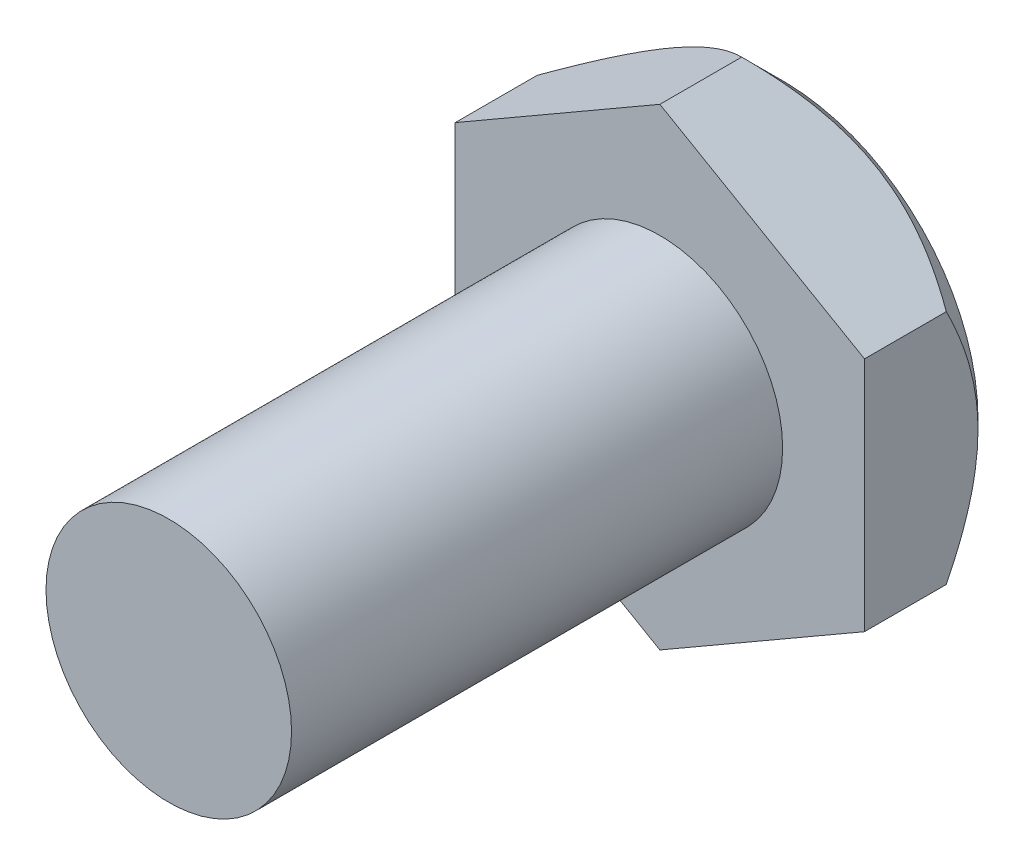
ISO-10303-21;
HEADER;
FILE_DESCRIPTION(('STEP AP214'),'2;1');
FILE_NAME('part.step','',(''),(''),'','','');
FILE_SCHEMA(('AUTOMOTIVE_DESIGN { 1 0 10303 214 1 1 1 1 }'));
ENDSEC;
DATA;
#1=APPLICATION_CONTEXT('core data for automotive mechanical design processes');
#2=APPLICATION_PROTOCOL_DEFINITION('international standard','automotive_design',2000,#1);
#3=PRODUCT_CONTEXT('',#1,'mechanical');
#4=PRODUCT('Part','Part','',(#3));
#5=PRODUCT_RELATED_PRODUCT_CATEGORY('part','',(#4));
#6=PRODUCT_DEFINITION_FORMATION('','',#4);
#7=PRODUCT_DEFINITION_CONTEXT('part definition',#1,'design');
#8=PRODUCT_DEFINITION('design','',#6,#7);
#9=PRODUCT_DEFINITION_SHAPE('','',#8);
#10=(LENGTH_UNIT() NAMED_UNIT(*) SI_UNIT(.MILLI.,.METRE.));
#11=(NAMED_UNIT(*) PLANE_ANGLE_UNIT() SI_UNIT($,.RADIAN.));
#12=(NAMED_UNIT(*) SI_UNIT($,.STERADIAN.) SOLID_ANGLE_UNIT());
#13=UNCERTAINTY_MEASURE_WITH_UNIT(LENGTH_MEASURE(1.E-05),#10,'distance_accuracy_value','');
#14=(GEOMETRIC_REPRESENTATION_CONTEXT(3) GLOBAL_UNCERTAINTY_ASSIGNED_CONTEXT((#13)) GLOBAL_UNIT_ASSIGNED_CONTEXT((#10,
#11,#12)) REPRESENTATION_CONTEXT('',''));
#15=CARTESIAN_POINT('',(0.,0.,0.));
#16=DIRECTION('',(0.,0.,1.));
#17=DIRECTION('',(1.,0.,0.));
#18=AXIS2_PLACEMENT_3D('',#15,#16,#17);
#19=CARTESIAN_POINT('',(-5.,-2.88675134594813,3.));
#20=DIRECTION('',(0.5,0.866025403784439,0.));
#21=DIRECTION('',(-0.866025403784439,0.5,0.));
#22=AXIS2_PLACEMENT_3D('',#19,#20,#21);
#23=PLANE('',#22);
#24=CARTESIAN_POINT('',(0.000199999999999995,-5.77361816195009,1.00011547351787));
#25=CARTESIAN_POINT('',(-0.0857727681733071,-5.72398176110226,0.950483545604258));
#26=CARTESIAN_POINT('',(-0.172406369471809,-5.6739638280717,0.902374725286902));
#27=CARTESIAN_POINT('',(-0.347124889028838,-5.57309004377304,0.809666631329777));
#28=CARTESIAN_POINT('',(-0.435210568643609,-5.5222337529357,0.765069274501485));
#29=CARTESIAN_POINT('',(-0.702658569860328,-5.367822577439,0.636859072128254));
#30=CARTESIAN_POINT('',(-0.884284999421825,-5.26296050943972,0.559375065501519));
#31=CARTESIAN_POINT('',(-1.25054924277182,-5.05149774994707,0.426688944425516));
#32=CARTESIAN_POINT('',(-1.4350934376246,-4.94495110937143,0.371152540645836));
#33=CARTESIAN_POINT('',(-1.71494377217237,-4.78337944338747,0.306910494047517));
#34=CARTESIAN_POINT('',(-1.80863923991279,-4.72928433986569,0.288682163338637));
#35=CARTESIAN_POINT('',(-1.99682352572352,-4.6206360917956,0.258992187126121));
#36=CARTESIAN_POINT('',(-2.09131222308104,-4.56608301694086,0.247529530305084));
#37=CARTESIAN_POINT('',(-2.32156625980077,-4.43314578685873,0.228310861745981));
#38=CARTESIAN_POINT('',(-2.45757968486242,-4.35461839928599,0.224278288259711));
#39=CARTESIAN_POINT('',(-2.72936141189438,-4.19770514602326,0.231045854105308));
#40=CARTESIAN_POINT('',(-2.86512961123581,-4.1193193395861,0.241851192970995));
#41=CARTESIAN_POINT('',(-3.13538603207474,-3.96328672226451,0.277657649898035));
#42=CARTESIAN_POINT('',(-3.26987265077583,-3.88564083675504,0.302674643958259));
#43=CARTESIAN_POINT('',(-3.53653439939645,-3.73168360440635,0.36554432498943));
#44=CARTESIAN_POINT('',(-3.66870970573535,-3.65537215571136,0.403396027767556));
#45=CARTESIAN_POINT('',(-3.9033482065223,-3.51990355411977,0.481269886760533));
#46=CARTESIAN_POINT('',(-4.00633089069878,-3.4604464736886,0.519244250419013));
#47=CARTESIAN_POINT('',(-4.21044753419216,-3.34259967462162,0.601312626173942));
#48=CARTESIAN_POINT('',(-4.31158143726391,-3.28420998845895,0.645406824103549));
#49=CARTESIAN_POINT('',(-4.51168198823797,-3.16868188148908,0.738726385352358));
#50=CARTESIAN_POINT('',(-4.61065432718708,-3.11154017495448,0.787935612709389));
#51=CARTESIAN_POINT('',(-4.80676624461304,-2.99831490663731,0.890839122843004));
#52=CARTESIAN_POINT('',(-4.90390690306938,-2.94223072132829,0.944530654549019));
#53=CARTESIAN_POINT('',(-5.0002,-2.88663587589429,1.00011547351787));
#54=B_SPLINE_CURVE_WITH_KNOTS('',3,(#24,#25,#26,#27,#28,#29,#30,#31,#32,#33,#34,#35,#36,#37,#38,
#39,#40,#41,#42,#43,#44,#45,#46,#47,#48,#49,#50,#51,#52,#53),.UNSPECIFIED.,.F.,.F.,(4,2,2,2,2,2,
2,2,2,2,2,2,2,2,4),(0.,0.332945616209567,0.666071736106988,1.33592065243334,1.99513262597481,
2.32409207808823,2.6530023456369,3.12358963991982,3.59434188052352,4.06562104077025,
4.53686407049608,4.91117956742315,5.28550643319669,5.65868635377114,6.03163889109472),.UNSPECIFIED.);
#55=CARTESIAN_POINT('',(0.,-5.77350269189626,1.));
#56=VERTEX_POINT('',#55);
#57=CARTESIAN_POINT('',(-5.,-2.88675134594813,1.));
#58=VERTEX_POINT('',#57);
#59=EDGE_CURVE('E68',#56,#58,#54,.T.);
#60=ORIENTED_EDGE('',*,*,#59,.F.);
#61=DIRECTION('',(0.,0.,-1.));
#62=VECTOR('',#61,1.);
#63=CARTESIAN_POINT('',(0.,-5.77350269189626,3.));
#64=LINE('',#63,#62);
#65=CARTESIAN_POINT('',(0.,-5.77350269189626,3.));
#66=VERTEX_POINT('',#65);
#67=EDGE_CURVE('E54',#66,#56,#64,.T.);
#68=ORIENTED_EDGE('',*,*,#67,.F.);
#69=DIRECTION('',(0.866025403784439,-0.5,0.));
#70=VECTOR('',#69,1.);
#71=CARTESIAN_POINT('',(-5.,-2.88675134594813,3.));
#72=LINE('',#71,#70);
#73=CARTESIAN_POINT('',(-5.,-2.88675134594813,3.));
#74=VERTEX_POINT('',#73);
#75=EDGE_CURVE('E159',#74,#66,#72,.T.);
#76=ORIENTED_EDGE('',*,*,#75,.F.);
#77=DIRECTION('',(0.,0.,-1.));
#78=VECTOR('',#77,1.);
#79=CARTESIAN_POINT('',(-5.,-2.88675134594813,3.));
#80=LINE('',#79,#78);
#81=EDGE_CURVE('E141',#74,#58,#80,.T.);
#82=ORIENTED_EDGE('',*,*,#81,.T.);
#83=EDGE_LOOP('',(#60,#68,#76,#82));
#84=FACE_BOUND('',#83,.T.);
#85=ADVANCED_FACE('F51',(#84),#23,.F.);
#86=CARTESIAN_POINT('',(0.,-5.77350269189626,3.));
#87=DIRECTION('',(-0.5,0.866025403784438,0.));
#88=DIRECTION('',(-0.866025403784438,-0.5,0.));
#89=AXIS2_PLACEMENT_3D('',#86,#87,#88);
#90=PLANE('',#89);
#91=CARTESIAN_POINT('',(5.0002,-2.88663587589429,1.00011547351787));
#92=CARTESIAN_POINT('',(4.91422723182669,-2.93627227674212,0.950483545604257));
#93=CARTESIAN_POINT('',(4.82759363052819,-2.98629020977268,0.902374725286901));
#94=CARTESIAN_POINT('',(4.65287511097116,-3.08716399407134,0.809666631329776));
#95=CARTESIAN_POINT('',(4.56478943135639,-3.13802028490868,0.765069274501483));
#96=CARTESIAN_POINT('',(4.29734143013967,-3.29243146040538,0.636859072128253));
#97=CARTESIAN_POINT('',(4.11571500057817,-3.39729352840466,0.559375065501518));
#98=CARTESIAN_POINT('',(3.74945075722818,-3.60875628789732,0.426688944425514));
#99=CARTESIAN_POINT('',(3.5649065623754,-3.71530292847296,0.371152540645833));
#100=CARTESIAN_POINT('',(3.28505622782763,-3.87687459445692,0.306910494047514));
#101=CARTESIAN_POINT('',(3.19136076008721,-3.9309696979787,0.288682163338634));
#102=CARTESIAN_POINT('',(3.00317647427648,-4.03961794604878,0.258992187126118));
#103=CARTESIAN_POINT('',(2.90868777691895,-4.09417102090352,0.247529530305082));
#104=CARTESIAN_POINT('',(2.67843374019923,-4.22710825098565,0.228310861745979));
#105=CARTESIAN_POINT('',(2.54242031513758,-4.3056356385584,0.224278288259709));
#106=CARTESIAN_POINT('',(2.27063858810562,-4.46254889182113,0.231045854105305));
#107=CARTESIAN_POINT('',(2.13487038876419,-4.54093469825829,0.241851192970993));
#108=CARTESIAN_POINT('',(1.86461396792526,-4.69696731557987,0.277657649898033));
#109=CARTESIAN_POINT('',(1.73012734922417,-4.77461320108935,0.302674643958258));
#110=CARTESIAN_POINT('',(1.46346560060355,-4.92857043343804,0.365544324989429));
#111=CARTESIAN_POINT('',(1.33129029426465,-5.00488188213303,0.403396027767555));
#112=CARTESIAN_POINT('',(1.0966517934777,-5.14035048372462,0.481269886760531));
#113=CARTESIAN_POINT('',(0.993669109301218,-5.19980756415578,0.519244250419011));
#114=CARTESIAN_POINT('',(0.78955246580784,-5.31765436322277,0.601312626173941));
#115=CARTESIAN_POINT('',(0.688418562736091,-5.37604404938544,0.645406824103548));
#116=CARTESIAN_POINT('',(0.488318011762032,-5.4915721563553,0.738726385352357));
#117=CARTESIAN_POINT('',(0.389345672812915,-5.5487138628899,0.787935612709388));
#118=CARTESIAN_POINT('',(0.19323375538696,-5.66193913120707,0.890839122843003));
#119=CARTESIAN_POINT('',(0.0960930969306197,-5.7180233165161,0.944530654549018));
#120=CARTESIAN_POINT('',(-0.00020000000000003,-5.7736181619501,1.00011547351787));
#121=B_SPLINE_CURVE_WITH_KNOTS('',3,(#91,#92,#93,#94,#95,#96,#97,#98,#99,#100,#101,#102,#103,
#104,#105,#106,#107,#108,#109,#110,#111,#112,#113,#114,#115,#116,#117,#118,#119,#120),
.UNSPECIFIED.,.F.,.F.,(4,2,2,2,2,2,2,2,2,2,2,2,2,2,4),(0.,0.332945616209567,0.666071736106989,
1.33592065243334,1.99513262597481,2.32409207808823,2.6530023456369,3.12358963991982,
3.59434188052352,4.06562104077025,4.53686407049609,4.91117956742315,5.28550643319669,
5.65868635377115,6.03163889109473),.UNSPECIFIED.);
#122=CARTESIAN_POINT('',(5.,-2.88675134594813,1.));
#123=VERTEX_POINT('',#122);
#124=EDGE_CURVE('E126',#123,#56,#121,.T.);
#125=ORIENTED_EDGE('',*,*,#124,.F.);
#126=DIRECTION('',(0.,0.,-1.));
#127=VECTOR('',#126,1.);
#128=CARTESIAN_POINT('',(5.,-2.88675134594813,3.));
#129=LINE('',#128,#127);
#130=CARTESIAN_POINT('',(5.,-2.88675134594813,3.));
#131=VERTEX_POINT('',#130);
#132=EDGE_CURVE('E127',#131,#123,#129,.T.);
#133=ORIENTED_EDGE('',*,*,#132,.F.);
#134=DIRECTION('',(0.866025403784438,0.5,0.));
#135=VECTOR('',#134,1.);
#136=CARTESIAN_POINT('',(0.,-5.77350269189626,3.));
#137=LINE('',#136,#135);
#138=EDGE_CURVE('E160',#66,#131,#137,.T.);
#139=ORIENTED_EDGE('',*,*,#138,.F.);
#140=ORIENTED_EDGE('',*,*,#67,.T.);
#141=EDGE_LOOP('',(#125,#133,#139,#140));
#142=FACE_BOUND('',#141,.T.);
#143=ADVANCED_FACE('F216',(#142),#90,.F.);
#144=CARTESIAN_POINT('',(5.,-2.88675134594813,3.));
#145=DIRECTION('',(-1.,0.,0.));
#146=DIRECTION('',(0.,-1.,0.));
#147=AXIS2_PLACEMENT_3D('',#144,#145,#146);
#148=PLANE('',#147);
#149=CARTESIAN_POINT('',(5.,8.74641662303045,5.30120840786354));
#150=CARTESIAN_POINT('',(5.,8.61716722747173,5.18900265269324));
#151=CARTESIAN_POINT('',(5.,8.4876177762151,5.07714279282813));
#152=CARTESIAN_POINT('',(5.,8.22783886568773,4.85421137306163));
#153=CARTESIAN_POINT('',(5.,8.09760939532867,4.74313982608448));
#154=CARTESIAN_POINT('',(5.,7.70566734866917,4.41115617610398));
#155=CARTESIAN_POINT('',(5.,7.44281985997348,4.19157843738422));
#156=CARTESIAN_POINT('',(5.,6.90728256215141,3.75214021004564));
#157=CARTESIAN_POINT('',(5.,6.63450482165786,3.53238666470403));
#158=CARTESIAN_POINT('',(5.,6.0838296799802,3.09948407125663));
#159=CARTESIAN_POINT('',(5.,5.80593357662146,2.8863333846965));
#160=CARTESIAN_POINT('',(5.,5.38378753376033,2.57335417688988));
#161=CARTESIAN_POINT('',(5.,5.24208933175034,2.47008359846257));
#162=CARTESIAN_POINT('',(5.,4.95671624927881,2.26631520865756));
#163=CARTESIAN_POINT('',(5.,4.81304144911579,2.1658172851374));
#164=CARTESIAN_POINT('',(5.,4.52327399537162,1.96806860455872));
#165=CARTESIAN_POINT('',(5.,4.37717923691745,1.87082092322896));
#166=CARTESIAN_POINT('',(5.,4.08235982087795,1.68041025635652));
#167=CARTESIAN_POINT('',(5.,3.93363539364334,1.58724691550166));
#168=CARTESIAN_POINT('',(5.,3.63427030631389,1.40660875248025));
#169=CARTESIAN_POINT('',(5.,3.48365224734247,1.31909664823556));
#170=CARTESIAN_POINT('',(5.,3.17899028727337,1.15017049908506));
#171=CARTESIAN_POINT('',(5.,3.02494597608893,1.06875718929086));
#172=CARTESIAN_POINT('',(5.,2.71327651039533,0.913643190475442));
#173=CARTESIAN_POINT('',(5.,2.5556569897211,0.839931271085124));
#174=CARTESIAN_POINT('',(5.,2.23636855072573,0.701954577855023));
#175=CARTESIAN_POINT('',(5.,2.07470123003844,0.637686143454943));
#176=CARTESIAN_POINT('',(5.,1.74341514966677,0.519419891787053));
#177=CARTESIAN_POINT('',(5.,1.57369908899831,0.465690806004504));
#178=CARTESIAN_POINT('',(5.,1.23024809831044,0.372972773426494));
#179=CARTESIAN_POINT('',(5.,1.05651381384527,0.333981476125331));
#180=CARTESIAN_POINT('',(5.,0.707111716198539,0.273340953601916));
#181=CARTESIAN_POINT('',(5.,0.53146295994004,0.251584101926988));
#182=CARTESIAN_POINT('',(5.,0.17884205730549,0.226605435627371));
#183=CARTESIAN_POINT('',(5.,0.00187005969027966,0.223381567957098));
#184=CARTESIAN_POINT('',(5.,-0.351677312644601,0.235729427957355));
#185=CARTESIAN_POINT('',(5.,-0.528251644969084,0.251330345354395));
#186=CARTESIAN_POINT('',(5.,-0.878922878802893,0.300185950940643));
#187=CARTESIAN_POINT('',(5.,-1.05301927886701,0.333444161614084));
#188=CARTESIAN_POINT('',(5.,-1.3987045104717,0.415712242024392));
#189=CARTESIAN_POINT('',(5.,-1.57026635442497,0.46483351901479));
#190=CARTESIAN_POINT('',(5.,-1.90902834045999,0.576149176266458));
#191=CARTESIAN_POINT('',(5.,-2.07622841650056,0.638343754340509));
#192=CARTESIAN_POINT('',(5.,-2.44237261212088,0.788103153381491));
#193=CARTESIAN_POINT('',(5.,-2.64025507818795,0.878241389720284));
#194=CARTESIAN_POINT('',(5.,-3.03013540194507,1.07054933532841));
#195=CARTESIAN_POINT('',(5.,-3.22212979396385,1.17272596527714));
#196=CARTESIAN_POINT('',(5.,-3.60131488951685,1.38644051823743));
#197=CARTESIAN_POINT('',(5.,-3.78849486749627,1.49799731621704));
#198=CARTESIAN_POINT('',(5.,-4.15840113964403,1.72813928385275));
#199=CARTESIAN_POINT('',(5.,-4.34112830476976,1.84672306322425));
#200=CARTESIAN_POINT('',(5.,-4.70385374189547,2.09002844075615));
#201=CARTESIAN_POINT('',(5.,-4.88383213902442,2.21477952902229));
#202=CARTESIAN_POINT('',(5.,-5.24067161838535,2.46866048898804));
#203=CARTESIAN_POINT('',(5.,-5.41753258815998,2.59779051816323));
#204=CARTESIAN_POINT('',(5.,-5.76843263526247,2.8593974426427));
#205=CARTESIAN_POINT('',(5.,-5.94247477144851,2.99187024633398));
#206=CARTESIAN_POINT('',(5.,-6.28836717451622,3.25965261483977));
#207=CARTESIAN_POINT('',(5.,-6.46021736942767,3.39496227241591));
#208=CARTESIAN_POINT('',(5.,-6.81175541238474,3.67565032556434));
#209=CARTESIAN_POINT('',(5.,-6.99133474536086,3.82116441788712));
#210=CARTESIAN_POINT('',(5.,-7.34874142921753,4.11432958177959));
#211=CARTESIAN_POINT('',(5.,-7.52656875943068,4.26198067850774));
#212=CARTESIAN_POINT('',(5.,-7.87878816127479,4.55742406898611));
#213=CARTESIAN_POINT('',(5.,-8.0531965095584,4.70519698599771));
#214=CARTESIAN_POINT('',(5.,-8.40071799614817,5.00218161213356));
#215=CARTESIAN_POINT('',(5.,-8.57383141139473,5.15139299703375));
#216=CARTESIAN_POINT('',(5.,-8.74641662303044,5.30120840786354));
#217=B_SPLINE_CURVE_WITH_KNOTS('',3,(#149,#150,#151,#152,#153,#154,#155,#156,#157,#158,#159,
#160,#161,#162,#163,#164,#165,#166,#167,#168,#169,#170,#171,#172,#173,#174,#175,#176,#177,#178,
#179,#180,#181,#182,#183,#184,#185,#186,#187,#188,#189,#190,#191,#192,#193,#194,#195,#196,#197,
#198,#199,#200,#201,#202,#203,#204,#205,#206,#207,#208,#209,#210,#211,#212,#213,#214,#215,#216),
.UNSPECIFIED.,.F.,.F.,(4,2,2,2,2,2,2,2,2,2,2,2,2,2,2,2,2,2,2,2,2,2,2,2,2,2,2,2,2,2,2,2,2,4),(0.,
0.513476804360356,1.02696200771218,2.05440464274526,3.10519307167231,4.15571863124172,
4.68170485901195,5.20766978152949,5.73411909352894,6.26052251646932,6.78299524430335,
7.30553084683201,7.82729351501778,8.34885339673756,8.88235034246742,9.4157621657062,
9.94581605965252,10.4758112341947,11.0066292768164,11.537553253067,12.0722901283652,
12.6070350953767,13.2588184936859,13.9109784370993,14.5644836027155,15.2178599015941,
15.874738064042,16.5316398742655,17.1877732869576,17.8439281879695,18.5373113067269,
19.2307025951712,19.9164752192631,20.6020967282288),.UNSPECIFIED.);
#218=CARTESIAN_POINT('',(5.,2.88675134594813,1.));
#219=VERTEX_POINT('',#218);
#220=EDGE_CURVE('E107',#219,#123,#217,.T.);
#221=ORIENTED_EDGE('',*,*,#220,.F.);
#222=DIRECTION('',(0.,0.,-1.));
#223=VECTOR('',#222,1.);
#224=CARTESIAN_POINT('',(5.,2.88675134594813,3.));
#225=LINE('',#224,#223);
#226=CARTESIAN_POINT('',(5.,2.88675134594813,3.));
#227=VERTEX_POINT('',#226);
#228=EDGE_CURVE('E123',#227,#219,#225,.T.);
#229=ORIENTED_EDGE('',*,*,#228,.F.);
#230=DIRECTION('',(0.,1.,0.));
#231=VECTOR('',#230,1.);
#232=CARTESIAN_POINT('',(5.,-2.88675134594813,3.));
#233=LINE('',#232,#231);
#234=EDGE_CURVE('E152',#131,#227,#233,.T.);
#235=ORIENTED_EDGE('',*,*,#234,.F.);
#236=ORIENTED_EDGE('',*,*,#132,.T.);
#237=EDGE_LOOP('',(#221,#229,#235,#236));
#238=FACE_BOUND('',#237,.T.);
#239=ADVANCED_FACE('F122',(#238),#148,.F.);
#240=CARTESIAN_POINT('',(5.,2.88675134594813,3.));
#241=DIRECTION('',(-0.5,-0.866025403784439,0.));
#242=DIRECTION('',(0.866025403784439,-0.5,0.));
#243=AXIS2_PLACEMENT_3D('',#240,#241,#242);
#244=PLANE('',#243);
#245=CARTESIAN_POINT('',(-0.000200000000002289,5.7736181619501,1.00011547351787));
#246=CARTESIAN_POINT('',(0.0857727681733046,5.72398176110226,0.950483545604261));
#247=CARTESIAN_POINT('',(0.172406369471806,5.67396382807171,0.902374725286905));
#248=CARTESIAN_POINT('',(0.347124889028836,5.57309004377304,0.80966663132978));
#249=CARTESIAN_POINT('',(0.435210568643606,5.5222337529357,0.765069274501488));
#250=CARTESIAN_POINT('',(0.702658569860326,5.367822577439,0.636859072128257));
#251=CARTESIAN_POINT('',(0.884284999421824,5.26296050943972,0.559375065501521));
#252=CARTESIAN_POINT('',(1.25054924277182,5.05149774994707,0.426688944425517));
#253=CARTESIAN_POINT('',(1.4350934376246,4.94495110937143,0.371152540645838));
#254=CARTESIAN_POINT('',(1.71494377217237,4.78337944338747,0.306910494047518));
#255=CARTESIAN_POINT('',(1.80863923991279,4.72928433986569,0.288682163338638));
#256=CARTESIAN_POINT('',(1.99682352572353,4.6206360917956,0.258992187126122));
#257=CARTESIAN_POINT('',(2.09131222308105,4.56608301694086,0.247529530305086));
#258=CARTESIAN_POINT('',(2.32156625980077,4.43314578685873,0.228310861745983));
#259=CARTESIAN_POINT('',(2.45757968486242,4.35461839928599,0.224278288259713));
#260=CARTESIAN_POINT('',(2.72936141189439,4.19770514602326,0.231045854105309));
#261=CARTESIAN_POINT('',(2.86512961123581,4.1193193395861,0.241851192970996));
#262=CARTESIAN_POINT('',(3.13538603207474,3.96328672226451,0.277657649898037));
#263=CARTESIAN_POINT('',(3.26987265077583,3.88564083675504,0.302674643958261));
#264=CARTESIAN_POINT('',(3.53653439939645,3.73168360440635,0.365544324989433));
#265=CARTESIAN_POINT('',(3.66870970573536,3.65537215571136,0.403396027767558));
#266=CARTESIAN_POINT('',(3.9033482065223,3.51990355411977,0.481269886760536));
#267=CARTESIAN_POINT('',(4.00633089069878,3.4604464736886,0.519244250419016));
#268=CARTESIAN_POINT('',(4.21044753419216,3.34259967462162,0.601312626173944));
#269=CARTESIAN_POINT('',(4.31158143726391,3.28420998845895,0.645406824103551));
#270=CARTESIAN_POINT('',(4.51168198823797,3.16868188148908,0.738726385352359));
#271=CARTESIAN_POINT('',(4.61065432718708,3.11154017495448,0.78793561270939));
#272=CARTESIAN_POINT('',(4.80676624461304,2.99831490663732,0.890839122843005));
#273=CARTESIAN_POINT('',(4.90390690306938,2.94223072132829,0.944530654549019));
#274=CARTESIAN_POINT('',(5.0002,2.88663587589429,1.00011547351787));
#275=B_SPLINE_CURVE_WITH_KNOTS('',3,(#245,#246,#247,#248,#249,#250,#251,#252,#253,#254,#255,
#256,#257,#258,#259,#260,#261,#262,#263,#264,#265,#266,#267,#268,#269,#270,#271,#272,#273,#274),
.UNSPECIFIED.,.F.,.F.,(4,2,2,2,2,2,2,2,2,2,2,2,2,2,4),(0.,0.332945616209567,0.666071736106989,
1.33592065243334,1.99513262597481,2.32409207808824,2.6530023456369,3.12358963991982,
3.59434188052352,4.06562104077026,4.53686407049609,4.91117956742316,5.28550643319669,
5.65868635377115,6.03163889109472),.UNSPECIFIED.);
#276=CARTESIAN_POINT('',(0.,5.77350269189626,1.));
#277=VERTEX_POINT('',#276);
#278=EDGE_CURVE('E104',#277,#219,#275,.T.);
#279=ORIENTED_EDGE('',*,*,#278,.F.);
#280=DIRECTION('',(0.,0.,-1.));
#281=VECTOR('',#280,1.);
#282=CARTESIAN_POINT('',(0.,5.77350269189626,3.));
#283=LINE('',#282,#281);
#284=CARTESIAN_POINT('',(0.,5.77350269189626,3.));
#285=VERTEX_POINT('',#284);
#286=EDGE_CURVE('E135',#285,#277,#283,.T.);
#287=ORIENTED_EDGE('',*,*,#286,.F.);
#288=DIRECTION('',(-0.866025403784439,0.5,0.));
#289=VECTOR('',#288,1.);
#290=CARTESIAN_POINT('',(5.,2.88675134594813,3.));
#291=LINE('',#290,#289);
#292=EDGE_CURVE('E134',#227,#285,#291,.T.);
#293=ORIENTED_EDGE('',*,*,#292,.F.);
#294=ORIENTED_EDGE('',*,*,#228,.T.);
#295=EDGE_LOOP('',(#279,#287,#293,#294));
#296=FACE_BOUND('',#295,.T.);
#297=ADVANCED_FACE('F128',(#296),#244,.F.);
#298=CARTESIAN_POINT('',(0.,5.77350269189626,3.));
#299=DIRECTION('',(0.5,-0.866025403784438,0.));
#300=DIRECTION('',(0.866025403784438,0.500000000000001,0.));
#301=AXIS2_PLACEMENT_3D('',#298,#299,#300);
#302=PLANE('',#301);
#303=CARTESIAN_POINT('',(-5.0002,2.88663587589429,1.00011547351787));
#304=CARTESIAN_POINT('',(-4.9142272318267,2.93627227674213,0.95048354560426));
#305=CARTESIAN_POINT('',(-4.82759363052819,2.98629020977268,0.902374725286904));
#306=CARTESIAN_POINT('',(-4.65287511097116,3.08716399407135,0.809666631329779));
#307=CARTESIAN_POINT('',(-4.56478943135639,3.13802028490869,0.765069274501486));
#308=CARTESIAN_POINT('',(-4.29734143013967,3.29243146040539,0.636859072128256));
#309=CARTESIAN_POINT('',(-4.11571500057818,3.39729352840467,0.559375065501521));
#310=CARTESIAN_POINT('',(-3.74945075722818,3.60875628789732,0.426688944425517));
#311=CARTESIAN_POINT('',(-3.5649065623754,3.71530292847296,0.371152540645837));
#312=CARTESIAN_POINT('',(-3.28505622782763,3.87687459445692,0.306910494047518));
#313=CARTESIAN_POINT('',(-3.19136076008721,3.9309696979787,0.288682163338639));
#314=CARTESIAN_POINT('',(-3.00317647427648,4.03961794604878,0.258992187126123));
#315=CARTESIAN_POINT('',(-2.90868777691896,4.09417102090353,0.247529530305086));
#316=CARTESIAN_POINT('',(-2.67843374019923,4.22710825098566,0.228310861745982));
#317=CARTESIAN_POINT('',(-2.54242031513758,4.3056356385584,0.224278288259713));
#318=CARTESIAN_POINT('',(-2.27063858810562,4.46254889182113,0.231045854105309));
#319=CARTESIAN_POINT('',(-2.13487038876419,4.54093469825829,0.241851192970996));
#320=CARTESIAN_POINT('',(-1.86461396792526,4.69696731557988,0.277657649898037));
#321=CARTESIAN_POINT('',(-1.73012734922417,4.77461320108935,0.302674643958262));
#322=CARTESIAN_POINT('',(-1.46346560060355,4.92857043343804,0.365544324989433));
#323=CARTESIAN_POINT('',(-1.33129029426465,5.00488188213303,0.403396027767559));
#324=CARTESIAN_POINT('',(-1.09665179347771,5.14035048372462,0.481269886760536));
#325=CARTESIAN_POINT('',(-0.99366910930122,5.19980756415579,0.519244250419016));
#326=CARTESIAN_POINT('',(-0.789552465807842,5.31765436322277,0.601312626173945));
#327=CARTESIAN_POINT('',(-0.688418562736092,5.37604404938544,0.645406824103552));
#328=CARTESIAN_POINT('',(-0.488318011762034,5.49157215635531,0.73872638535236));
#329=CARTESIAN_POINT('',(-0.389345672812917,5.54871386288991,0.787935612709392));
#330=CARTESIAN_POINT('',(-0.193233755386962,5.66193913120708,0.890839122843007));
#331=CARTESIAN_POINT('',(-0.0960930969306217,5.7180233165161,0.944530654549022));
#332=CARTESIAN_POINT('',(0.000199999999997294,5.7736181619501,1.00011547351787));
#333=B_SPLINE_CURVE_WITH_KNOTS('',3,(#303,#304,#305,#306,#307,#308,#309,#310,#311,#312,#313,
#314,#315,#316,#317,#318,#319,#320,#321,#322,#323,#324,#325,#326,#327,#328,#329,#330,#331,#332),
.UNSPECIFIED.,.F.,.F.,(4,2,2,2,2,2,2,2,2,2,2,2,2,2,4),(0.,0.332945616209567,0.666071736106989,
1.33592065243334,1.99513262597481,2.32409207808823,2.6530023456369,3.12358963991982,
3.59434188052352,4.06562104077025,4.53686407049609,4.91117956742315,5.28550643319669,
5.65868635377115,6.03163889109472),.UNSPECIFIED.);
#334=CARTESIAN_POINT('',(-5.,2.88675134594813,1.));
#335=VERTEX_POINT('',#334);
#336=EDGE_CURVE('E112',#335,#277,#333,.T.);
#337=ORIENTED_EDGE('',*,*,#336,.F.);
#338=DIRECTION('',(0.,0.,-1.));
#339=VECTOR('',#338,1.);
#340=CARTESIAN_POINT('',(-5.,2.88675134594813,3.));
#341=LINE('',#340,#339);
#342=CARTESIAN_POINT('',(-5.,2.88675134594813,3.));
#343=VERTEX_POINT('',#342);
#344=EDGE_CURVE('E140',#343,#335,#341,.T.);
#345=ORIENTED_EDGE('',*,*,#344,.F.);
#346=DIRECTION('',(-0.866025403784438,-0.500000000000001,0.));
#347=VECTOR('',#346,1.);
#348=CARTESIAN_POINT('',(0.,5.77350269189626,3.));
#349=LINE('',#348,#347);
#350=EDGE_CURVE('E149',#285,#343,#349,.T.);
#351=ORIENTED_EDGE('',*,*,#350,.F.);
#352=ORIENTED_EDGE('',*,*,#286,.T.);
#353=EDGE_LOOP('',(#337,#345,#351,#352));
#354=FACE_BOUND('',#353,.T.);
#355=ADVANCED_FACE('F243',(#354),#302,.F.);
#356=CARTESIAN_POINT('',(-5.,2.88675134594813,3.));
#357=DIRECTION('',(1.,0.,0.));
#358=DIRECTION('',(0.,1.,0.));
#359=AXIS2_PLACEMENT_3D('',#356,#357,#358);
#360=PLANE('',#359);
#361=CARTESIAN_POINT('',(-5.,-8.74641662303044,5.30120840786354));
#362=CARTESIAN_POINT('',(-5.,-8.61716722747173,5.18900265269323));
#363=CARTESIAN_POINT('',(-5.,-8.4876177762151,5.07714279282812));
#364=CARTESIAN_POINT('',(-5.,-8.22783886568772,4.85421137306163));
#365=CARTESIAN_POINT('',(-5.,-8.09760939532867,4.74313982608447));
#366=CARTESIAN_POINT('',(-5.,-7.70566734866916,4.41115617610397));
#367=CARTESIAN_POINT('',(-5.,-7.44281985997348,4.19157843738422));
#368=CARTESIAN_POINT('',(-5.,-6.90728256215141,3.75214021004564));
#369=CARTESIAN_POINT('',(-5.,-6.63450482165786,3.53238666470403));
#370=CARTESIAN_POINT('',(-5.,-6.08382967998019,3.09948407125663));
#371=CARTESIAN_POINT('',(-5.,-5.80593357662146,2.8863333846965));
#372=CARTESIAN_POINT('',(-5.,-5.38378753376033,2.57335417688988));
#373=CARTESIAN_POINT('',(-5.,-5.24208933175034,2.47008359846257));
#374=CARTESIAN_POINT('',(-5.,-4.95671624927881,2.26631520865755));
#375=CARTESIAN_POINT('',(-5.,-4.81304144911579,2.1658172851374));
#376=CARTESIAN_POINT('',(-5.,-4.52327399537162,1.96806860455871));
#377=CARTESIAN_POINT('',(-5.,-4.37717923691744,1.87082092322896));
#378=CARTESIAN_POINT('',(-5.,-4.08235982087794,1.68041025635652));
#379=CARTESIAN_POINT('',(-5.,-3.93363539364333,1.58724691550166));
#380=CARTESIAN_POINT('',(-5.,-3.63427030631388,1.40660875248025));
#381=CARTESIAN_POINT('',(-5.,-3.48365224734246,1.31909664823556));
#382=CARTESIAN_POINT('',(-5.,-3.17899028727336,1.15017049908506));
#383=CARTESIAN_POINT('',(-5.,-3.02494597608893,1.06875718929086));
#384=CARTESIAN_POINT('',(-5.,-2.71327651039532,0.913643190475441));
#385=CARTESIAN_POINT('',(-5.,-2.5556569897211,0.839931271085124));
#386=CARTESIAN_POINT('',(-5.,-2.23636855072572,0.701954577855023));
#387=CARTESIAN_POINT('',(-5.,-2.07470123003844,0.637686143454942));
#388=CARTESIAN_POINT('',(-5.,-1.74341514966677,0.519419891787052));
#389=CARTESIAN_POINT('',(-5.,-1.57369908899831,0.465690806004504));
#390=CARTESIAN_POINT('',(-5.,-1.23024809831043,0.372972773426495));
#391=CARTESIAN_POINT('',(-5.,-1.05651381384526,0.333981476125332));
#392=CARTESIAN_POINT('',(-5.,-0.707111716198534,0.273340953601917));
#393=CARTESIAN_POINT('',(-5.,-0.531462959940035,0.25158410192699));
#394=CARTESIAN_POINT('',(-5.,-0.178842057305485,0.226605435627373));
#395=CARTESIAN_POINT('',(-5.,-0.00187005969027525,0.2233815679571));
#396=CARTESIAN_POINT('',(-5.,0.351677312644604,0.235729427957357));
#397=CARTESIAN_POINT('',(-5.,0.528251644969087,0.251330345354398));
#398=CARTESIAN_POINT('',(-5.,0.878922878802895,0.300185950940646));
#399=CARTESIAN_POINT('',(-5.,1.05301927886701,0.333444161614086));
#400=CARTESIAN_POINT('',(-5.,1.3987045104717,0.415712242024394));
#401=CARTESIAN_POINT('',(-5.,1.57026635442498,0.464833519014792));
#402=CARTESIAN_POINT('',(-5.,1.90902834045999,0.57614917626646));
#403=CARTESIAN_POINT('',(-5.,2.07622841650056,0.638343754340511));
#404=CARTESIAN_POINT('',(-5.,2.44237261212088,0.788103153381492));
#405=CARTESIAN_POINT('',(-5.,2.64025507818795,0.878241389720285));
#406=CARTESIAN_POINT('',(-5.,3.03013540194507,1.07054933532841));
#407=CARTESIAN_POINT('',(-5.,3.22212979396385,1.17272596527714));
#408=CARTESIAN_POINT('',(-5.,3.60131488951685,1.38644051823743));
#409=CARTESIAN_POINT('',(-5.,3.78849486749627,1.49799731621704));
#410=CARTESIAN_POINT('',(-5.,4.15840113964403,1.72813928385275));
#411=CARTESIAN_POINT('',(-5.,4.34112830476976,1.84672306322425));
#412=CARTESIAN_POINT('',(-5.,4.70385374189547,2.09002844075615));
#413=CARTESIAN_POINT('',(-5.,4.88383213902442,2.2147795290223));
#414=CARTESIAN_POINT('',(-5.,5.24067161838535,2.46866048898804));
#415=CARTESIAN_POINT('',(-5.,5.41753258815999,2.59779051816323));
#416=CARTESIAN_POINT('',(-5.,5.76843263526248,2.8593974426427));
#417=CARTESIAN_POINT('',(-5.,5.94247477144851,2.99187024633398));
#418=CARTESIAN_POINT('',(-5.,6.28836717451622,3.25965261483977));
#419=CARTESIAN_POINT('',(-5.,6.46021736942768,3.39496227241591));
#420=CARTESIAN_POINT('',(-5.,6.81175541238474,3.67565032556434));
#421=CARTESIAN_POINT('',(-5.,6.99133474536086,3.82116441788712));
#422=CARTESIAN_POINT('',(-5.,7.34874142921754,4.1143295817796));
#423=CARTESIAN_POINT('',(-5.,7.52656875943069,4.26198067850774));
#424=CARTESIAN_POINT('',(-5.,7.8787881612748,4.55742406898612));
#425=CARTESIAN_POINT('',(-5.,8.0531965095584,4.70519698599772));
#426=CARTESIAN_POINT('',(-5.,8.40071799614818,5.00218161213357));
#427=CARTESIAN_POINT('',(-5.,8.57383141139473,5.15139299703375));
#428=CARTESIAN_POINT('',(-5.,8.74641662303044,5.30120840786354));
#429=B_SPLINE_CURVE_WITH_KNOTS('',3,(#361,#362,#363,#364,#365,#366,#367,#368,#369,#370,#371,
#372,#373,#374,#375,#376,#377,#378,#379,#380,#381,#382,#383,#384,#385,#386,#387,#388,#389,#390,
#391,#392,#393,#394,#395,#396,#397,#398,#399,#400,#401,#402,#403,#404,#405,#406,#407,#408,#409,
#410,#411,#412,#413,#414,#415,#416,#417,#418,#419,#420,#421,#422,#423,#424,#425,#426,#427,#428),
.UNSPECIFIED.,.F.,.F.,(4,2,2,2,2,2,2,2,2,2,2,2,2,2,2,2,2,2,2,2,2,2,2,2,2,2,2,2,2,2,2,2,2,4),(0.,
0.513476804360357,1.02696200771218,2.05440464274526,3.10519307167231,4.15571863124172,
4.68170485901195,5.20766978152949,5.73411909352894,6.26052251646933,6.78299524430335,
7.30553084683201,7.82729351501779,8.34885339673756,8.88235034246742,9.4157621657062,
9.94581605965253,10.4758112341947,11.0066292768164,11.537553253067,12.0722901283652,
12.6070350953767,13.2588184936859,13.9109784370993,14.5644836027156,15.2178599015941,
15.8747380640421,16.5316398742655,17.1877732869576,17.8439281879695,18.5373113067269,
19.2307025951712,19.9164752192631,20.6020967282288),.UNSPECIFIED.);
#430=EDGE_CURVE('E190',#58,#335,#429,.T.);
#431=ORIENTED_EDGE('',*,*,#430,.F.);
#432=ORIENTED_EDGE('',*,*,#81,.F.);
#433=DIRECTION('',(0.,-1.,0.));
#434=VECTOR('',#433,1.);
#435=CARTESIAN_POINT('',(-5.,2.88675134594813,3.));
#436=LINE('',#435,#434);
#437=EDGE_CURVE('E79',#343,#74,#436,.T.);
#438=ORIENTED_EDGE('',*,*,#437,.F.);
#439=ORIENTED_EDGE('',*,*,#344,.T.);
#440=EDGE_LOOP('',(#431,#432,#438,#439));
#441=FACE_BOUND('',#440,.T.);
#442=ADVANCED_FACE('F244',(#441),#360,.F.);
#443=CARTESIAN_POINT('',(0.,0.,3.));
#444=DIRECTION('',(0.,0.,1.));
#445=DIRECTION('',(1.,0.,0.));
#446=AXIS2_PLACEMENT_3D('',#443,#444,#445);
#447=PLANE('',#446);
#448=CARTESIAN_POINT('',(0.,0.,3.));
#449=DIRECTION('',(0.,0.,1.));
#450=DIRECTION('',(1.,0.,0.));
#451=AXIS2_PLACEMENT_3D('',#448,#449,#450);
#452=CIRCLE('',#451,3.);
#453=CARTESIAN_POINT('',(3.,0.,3.));
#454=VERTEX_POINT('',#453);
#455=EDGE_CURVE('E11',#454,#454,#452,.T.);
#456=ORIENTED_EDGE('',*,*,#455,.F.);
#457=EDGE_LOOP('',(#456));
#458=FACE_BOUND('',#457,.T.);
#459=ORIENTED_EDGE('',*,*,#75,.T.);
#460=ORIENTED_EDGE('',*,*,#138,.T.);
#461=ORIENTED_EDGE('',*,*,#234,.T.);
#462=ORIENTED_EDGE('',*,*,#292,.T.);
#463=ORIENTED_EDGE('',*,*,#350,.T.);
#464=ORIENTED_EDGE('',*,*,#437,.T.);
#465=EDGE_LOOP('',(#459,#460,#461,#462,#463,#464));
#466=FACE_BOUND('',#465,.T.);
#467=ADVANCED_FACE('F238',(#458,#466),#447,.T.);
#468=CARTESIAN_POINT('',(0.,0.,15.));
#469=DIRECTION('',(0.,0.,-1.));
#470=DIRECTION('',(-1.,0.,0.));
#471=AXIS2_PLACEMENT_3D('',#468,#469,#470);
#472=CYLINDRICAL_SURFACE('',#471,3.);
#473=CARTESIAN_POINT('',(0.,0.,15.));
#474=DIRECTION('',(0.,0.,1.));
#475=DIRECTION('',(1.,0.,0.));
#476=AXIS2_PLACEMENT_3D('',#473,#474,#475);
#477=CIRCLE('',#476,3.);
#478=CARTESIAN_POINT('',(3.,0.,15.));
#479=VERTEX_POINT('',#478);
#480=EDGE_CURVE('E165',#479,#479,#477,.T.);
#481=ORIENTED_EDGE('',*,*,#480,.F.);
#482=EDGE_LOOP('',(#481));
#483=FACE_BOUND('',#482,.T.);
#484=ORIENTED_EDGE('',*,*,#455,.T.);
#485=EDGE_LOOP('',(#484));
#486=FACE_BOUND('',#485,.T.);
#487=ADVANCED_FACE('F258',(#483,#486),#472,.T.);
#488=CARTESIAN_POINT('',(0.,0.,15.));
#489=DIRECTION('',(0.,0.,1.));
#490=DIRECTION('',(1.,0.,0.));
#491=AXIS2_PLACEMENT_3D('',#488,#489,#490);
#492=PLANE('',#491);
#493=ORIENTED_EDGE('',*,*,#480,.T.);
#494=EDGE_LOOP('',(#493));
#495=FACE_BOUND('',#494,.T.);
#496=ADVANCED_FACE('F185',(#495),#492,.T.);
#497=CARTESIAN_POINT('',(0.,0.,1.));
#498=DIRECTION('',(0.,0.,1.));
#499=DIRECTION('',(1.,0.,0.));
#500=AXIS2_PLACEMENT_3D('',#497,#498,#499);
#501=CONICAL_SURFACE('',#500,5.77350269189626,0.785398163397448);
#502=CARTESIAN_POINT('',(0.,0.,0.));
#503=DIRECTION('',(0.,0.,1.));
#504=DIRECTION('',(1.,0.,0.));
#505=AXIS2_PLACEMENT_3D('',#502,#503,#504);
#506=CIRCLE('',#505,4.77350269189626);
#507=CARTESIAN_POINT('',(4.77350269189626,0.,0.));
#508=VERTEX_POINT('',#507);
#509=EDGE_CURVE('E232',#508,#508,#506,.T.);
#510=ORIENTED_EDGE('',*,*,#509,.T.);
#511=EDGE_LOOP('',(#510));
#512=FACE_BOUND('',#511,.T.);
#513=ORIENTED_EDGE('',*,*,#59,.T.);
#514=ORIENTED_EDGE('',*,*,#430,.T.);
#515=ORIENTED_EDGE('',*,*,#336,.T.);
#516=ORIENTED_EDGE('',*,*,#278,.T.);
#517=ORIENTED_EDGE('',*,*,#220,.T.);
#518=ORIENTED_EDGE('',*,*,#124,.T.);
#519=EDGE_LOOP('',(#513,#514,#515,#516,#517,#518));
#520=FACE_BOUND('',#519,.T.);
#521=ADVANCED_FACE('F110',(#512,#520),#501,.T.);
#522=CARTESIAN_POINT('',(0.,0.,0.));
#523=DIRECTION('',(0.,0.,1.));
#524=DIRECTION('',(1.,0.,0.));
#525=AXIS2_PLACEMENT_3D('',#522,#523,#524);
#526=PLANE('',#525);
#527=ORIENTED_EDGE('',*,*,#509,.F.);
#528=EDGE_LOOP('',(#527));
#529=FACE_BOUND('',#528,.T.);
#530=ADVANCED_FACE('F182',(#529),#526,.F.);
#531=CLOSED_SHELL('',(#85,#143,#239,#297,#355,#442,#467,#487,#496,#521,#530));
#532=MANIFOLD_SOLID_BREP('B2',#531);
#533=ADVANCED_BREP_SHAPE_REPRESENTATION('',(#18,#532),#14);
#534=SHAPE_DEFINITION_REPRESENTATION(#9,#533);
ENDSEC;
END-ISO-10303-21;
